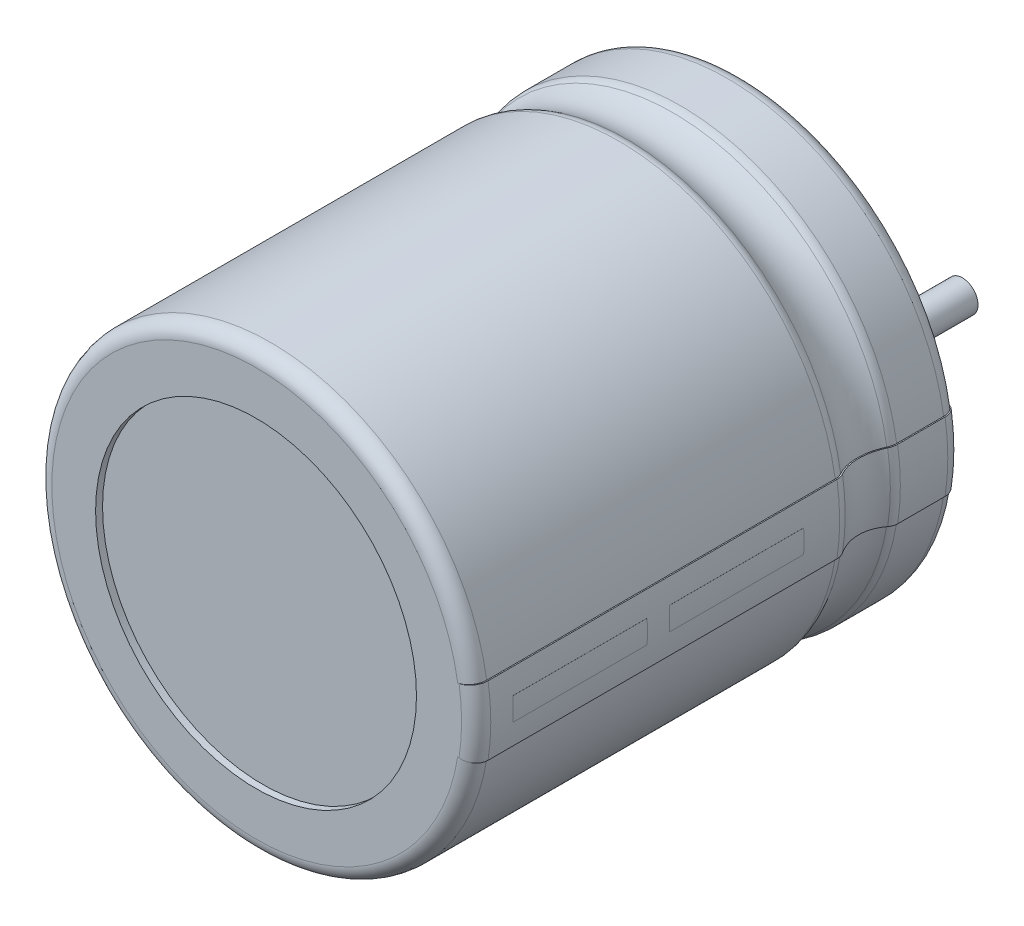
ISO-10303-21;
HEADER;
FILE_DESCRIPTION(('STEP AP214'),'2;1');
FILE_NAME('part.step','',(''),(''),'','','');
FILE_SCHEMA(('AUTOMOTIVE_DESIGN { 1 0 10303 214 1 1 1 1 }'));
ENDSEC;
DATA;
#1=APPLICATION_CONTEXT('core data for automotive mechanical design processes');
#2=APPLICATION_PROTOCOL_DEFINITION('international standard','automotive_design',2000,#1);
#3=PRODUCT_CONTEXT('',#1,'mechanical');
#4=PRODUCT('Part','Part','',(#3));
#5=PRODUCT_RELATED_PRODUCT_CATEGORY('part','',(#4));
#6=PRODUCT_DEFINITION_FORMATION('','',#4);
#7=PRODUCT_DEFINITION_CONTEXT('part definition',#1,'design');
#8=PRODUCT_DEFINITION('design','',#6,#7);
#9=PRODUCT_DEFINITION_SHAPE('','',#8);
#10=(LENGTH_UNIT() NAMED_UNIT(*) SI_UNIT(.MILLI.,.METRE.));
#11=(NAMED_UNIT(*) PLANE_ANGLE_UNIT() SI_UNIT($,.RADIAN.));
#12=(NAMED_UNIT(*) SI_UNIT($,.STERADIAN.) SOLID_ANGLE_UNIT());
#13=UNCERTAINTY_MEASURE_WITH_UNIT(LENGTH_MEASURE(1.E-05),#10,'distance_accuracy_value','');
#14=(GEOMETRIC_REPRESENTATION_CONTEXT(3) GLOBAL_UNCERTAINTY_ASSIGNED_CONTEXT((#13)) GLOBAL_UNIT_ASSIGNED_CONTEXT((#10,
#11,#12)) REPRESENTATION_CONTEXT('',''));
#15=CARTESIAN_POINT('',(0.,0.,0.));
#16=DIRECTION('',(0.,0.,1.));
#17=DIRECTION('',(1.,0.,0.));
#18=AXIS2_PLACEMENT_3D('',#15,#16,#17);
#19=CARTESIAN_POINT('',(0.000375956860391527,0.,1.33));
#20=DIRECTION('',(0.,0.,1.));
#21=DIRECTION('',(-1.,0.,0.));
#22=AXIS2_PLACEMENT_3D('',#19,#20,#21);
#23=TOROIDAL_SURFACE('',#22,3.654,0.63);
#24=CARTESIAN_POINT('',(3.60938915339502,-0.571611535257004,1.33));
#25=DIRECTION('',(0.156434465040231,0.987688340595138,0.));
#26=DIRECTION('',(0.987688340595138,-0.156434465040231,0.));
#27=AXIS2_PLACEMENT_3D('',#24,#25,#26);
#28=CIRCLE('',#27,0.63);
#29=CARTESIAN_POINT('',(3.08048204700633,-0.48784087922796,0.998126906785139));
#30=VERTEX_POINT('',#29);
#31=CARTESIAN_POINT('',(3.08048204700633,-0.48784087922796,1.66187309321486));
#32=VERTEX_POINT('',#31);
#33=EDGE_CURVE('E336',#30,#32,#28,.T.);
#34=ORIENTED_EDGE('',*,*,#33,.T.);
#35=CARTESIAN_POINT('',(0.000375956860391445,0.,1.66187309321486));
#36=DIRECTION('',(0.,0.,1.));
#37=DIRECTION('',(1.,0.,0.));
#38=AXIS2_PLACEMENT_3D('',#35,#36,#37);
#39=CIRCLE('',#38,3.1185);
#40=CARTESIAN_POINT('',(3.08048204700633,0.48784087922796,1.66187309321486));
#41=VERTEX_POINT('',#40);
#42=EDGE_CURVE('E345',#41,#32,#39,.T.);
#43=ORIENTED_EDGE('',*,*,#42,.F.);
#44=CARTESIAN_POINT('',(3.60938915339502,0.571611535257003,1.33));
#45=DIRECTION('',(0.156434465040231,-0.987688340595138,0.));
#46=DIRECTION('',(0.987688340595138,0.156434465040231,0.));
#47=AXIS2_PLACEMENT_3D('',#44,#45,#46);
#48=CIRCLE('',#47,0.63);
#49=CARTESIAN_POINT('',(3.08048204700633,0.48784087922796,0.998126906785139));
#50=VERTEX_POINT('',#49);
#51=EDGE_CURVE('E309',#41,#50,#48,.T.);
#52=ORIENTED_EDGE('',*,*,#51,.T.);
#53=CARTESIAN_POINT('',(0.000375956860391608,0.,0.998126906785138));
#54=DIRECTION('',(0.,0.,-1.));
#55=DIRECTION('',(1.,0.,0.));
#56=AXIS2_PLACEMENT_3D('',#53,#54,#55);
#57=CIRCLE('',#56,3.1185);
#58=EDGE_CURVE('E341',#30,#50,#57,.T.);
#59=ORIENTED_EDGE('',*,*,#58,.F.);
#60=EDGE_LOOP('',(#34,#43,#52,#59));
#61=FACE_BOUND('',#60,.T.);
#62=ADVANCED_FACE('F17',(#61),#23,.F.);
#63=CARTESIAN_POINT('',(0.000375956860391852,0.,0.));
#64=DIRECTION('',(0.,0.,-1.));
#65=DIRECTION('',(0.,-1.,0.));
#66=AXIS2_PLACEMENT_3D('',#63,#64,#65);
#67=PLANE('',#66);
#68=CARTESIAN_POINT('',(1.25037595686039,0.,0.));
#69=DIRECTION('',(0.,0.,1.));
#70=DIRECTION('',(1.,0.,0.));
#71=AXIS2_PLACEMENT_3D('',#68,#69,#70);
#72=CIRCLE('',#71,0.225);
#73=CARTESIAN_POINT('',(1.02537595686039,0.,0.));
#74=VERTEX_POINT('',#73);
#75=EDGE_CURVE('E286',#74,#74,#72,.T.);
#76=ORIENTED_EDGE('',*,*,#75,.T.);
#77=EDGE_LOOP('',(#76));
#78=FACE_BOUND('',#77,.T.);
#79=CARTESIAN_POINT('',(-1.24962404313961,0.,0.));
#80=DIRECTION('',(0.,0.,1.));
#81=DIRECTION('',(1.,0.,0.));
#82=AXIS2_PLACEMENT_3D('',#79,#80,#81);
#83=CIRCLE('',#82,0.225);
#84=CARTESIAN_POINT('',(-1.47462404313961,0.,0.));
#85=VERTEX_POINT('',#84);
#86=EDGE_CURVE('E329',#85,#85,#83,.T.);
#87=ORIENTED_EDGE('',*,*,#86,.T.);
#88=EDGE_LOOP('',(#87));
#89=FACE_BOUND('',#88,.T.);
#90=CARTESIAN_POINT('',(0.000375956860391852,0.,0.));
#91=DIRECTION('',(0.,0.,1.));
#92=DIRECTION('',(-1.,0.,0.));
#93=AXIS2_PLACEMENT_3D('',#90,#91,#92);
#94=CIRCLE('',#93,2.94);
#95=CARTESIAN_POINT('',(2.90417967821009,0.459917327218278,0.));
#96=VERTEX_POINT('',#95);
#97=CARTESIAN_POINT('',(2.90417967821009,-0.45991732721828,0.));
#98=VERTEX_POINT('',#97);
#99=EDGE_CURVE('E11',#96,#98,#94,.T.);
#100=ORIENTED_EDGE('',*,*,#99,.F.);
#101=DIRECTION('',(-0.987688340595138,-0.156434465040231,0.));
#102=VECTOR('',#101,1.);
#103=CARTESIAN_POINT('',(0.000375956860391616,0.,0.));
#104=LINE('',#103,#102);
#105=CARTESIAN_POINT('',(2.923933445022,0.463046016519083,0.));
#106=VERTEX_POINT('',#105);
#107=EDGE_CURVE('E452',#106,#96,#104,.T.);
#108=ORIENTED_EDGE('',*,*,#107,.F.);
#109=CARTESIAN_POINT('',(0.000375956860391852,0.,0.));
#110=DIRECTION('',(0.,0.,1.));
#111=DIRECTION('',(1.,0.,0.));
#112=AXIS2_PLACEMENT_3D('',#109,#110,#111);
#113=CIRCLE('',#112,2.96);
#114=CARTESIAN_POINT('',(2.923933445022,-0.463046016519085,0.));
#115=VERTEX_POINT('',#114);
#116=EDGE_CURVE('E368',#115,#106,#113,.T.);
#117=ORIENTED_EDGE('',*,*,#116,.F.);
#118=DIRECTION('',(0.987688340595138,-0.156434465040231,0.));
#119=VECTOR('',#118,1.);
#120=CARTESIAN_POINT('',(0.000375956860391852,0.,0.));
#121=LINE('',#120,#119);
#122=EDGE_CURVE('E410',#98,#115,#121,.T.);
#123=ORIENTED_EDGE('',*,*,#122,.F.);
#124=EDGE_LOOP('',(#100,#108,#117,#123));
#125=FACE_BOUND('',#124,.T.);
#126=ADVANCED_FACE('F552',(#78,#89,#125),#67,.T.);
#127=CARTESIAN_POINT('',(0.000375956860391801,0.,0.21));
#128=DIRECTION('',(0.,0.,-1.));
#129=DIRECTION('',(-1.,0.,0.));
#130=AXIS2_PLACEMENT_3D('',#127,#128,#129);
#131=TOROIDAL_SURFACE('',#130,2.94,0.21);
#132=CARTESIAN_POINT('',(2.9041796782101,-0.45991732721828,0.21));
#133=DIRECTION('',(-0.156434465040231,-0.987688340595138,0.));
#134=DIRECTION('',(0.987688340595138,-0.156434465040231,0.));
#135=AXIS2_PLACEMENT_3D('',#132,#133,#134);
#136=CIRCLE('',#135,0.21);
#137=CARTESIAN_POINT('',(3.11159422973507,-0.492768564876728,0.21));
#138=VERTEX_POINT('',#137);
#139=EDGE_CURVE('E357',#98,#138,#136,.T.);
#140=ORIENTED_EDGE('',*,*,#139,.T.);
#141=CARTESIAN_POINT('',(0.000375956860391801,0.,0.21));
#142=DIRECTION('',(0.,0.,-1.));
#143=DIRECTION('',(-1.,0.,0.));
#144=AXIS2_PLACEMENT_3D('',#141,#142,#143);
#145=CIRCLE('',#144,3.15);
#146=CARTESIAN_POINT('',(3.11159422973507,0.492768564876726,0.21));
#147=VERTEX_POINT('',#146);
#148=EDGE_CURVE('E28',#138,#147,#145,.T.);
#149=ORIENTED_EDGE('',*,*,#148,.T.);
#150=CARTESIAN_POINT('',(2.9041796782101,0.459917327218278,0.21));
#151=DIRECTION('',(-0.156434465040231,0.987688340595138,0.));
#152=DIRECTION('',(0.987688340595138,0.156434465040231,0.));
#153=AXIS2_PLACEMENT_3D('',#150,#151,#152);
#154=CIRCLE('',#153,0.21);
#155=EDGE_CURVE('E456',#147,#96,#154,.T.);
#156=ORIENTED_EDGE('',*,*,#155,.T.);
#157=ORIENTED_EDGE('',*,*,#99,.T.);
#158=EDGE_LOOP('',(#140,#149,#156,#157));
#159=FACE_BOUND('',#158,.T.);
#160=ADVANCED_FACE('F555',(#159),#131,.T.);
#161=CARTESIAN_POINT('',(0.000375956860390995,0.,3.5));
#162=DIRECTION('',(0.,0.,1.));
#163=DIRECTION('',(-1.,0.,0.));
#164=AXIS2_PLACEMENT_3D('',#161,#162,#163);
#165=CYLINDRICAL_SURFACE('',#164,3.15);
#166=DIRECTION('',(0.,0.,1.));
#167=VECTOR('',#166,1.);
#168=CARTESIAN_POINT('',(3.11159422973507,-0.492768564876727,3.5));
#169=LINE('',#168,#167);
#170=CARTESIAN_POINT('',(3.11159422973507,-0.492768564876728,0.887502542380186));
#171=VERTEX_POINT('',#170);
#172=EDGE_CURVE('E335',#138,#171,#169,.T.);
#173=ORIENTED_EDGE('',*,*,#172,.T.);
#174=CARTESIAN_POINT('',(0.000375956860391635,0.,0.887502542380185));
#175=DIRECTION('',(0.,0.,1.));
#176=DIRECTION('',(1.,0.,0.));
#177=AXIS2_PLACEMENT_3D('',#174,#175,#176);
#178=CIRCLE('',#177,3.15);
#179=CARTESIAN_POINT('',(3.11159422973507,0.492768564876726,0.887502542380186));
#180=VERTEX_POINT('',#179);
#181=EDGE_CURVE('E344',#180,#171,#178,.T.);
#182=ORIENTED_EDGE('',*,*,#181,.F.);
#183=DIRECTION('',(0.,0.,-1.));
#184=VECTOR('',#183,1.);
#185=CARTESIAN_POINT('',(3.11159422973507,0.492768564876727,3.5));
#186=LINE('',#185,#184);
#187=EDGE_CURVE('E397',#180,#147,#186,.T.);
#188=ORIENTED_EDGE('',*,*,#187,.T.);
#189=ORIENTED_EDGE('',*,*,#148,.F.);
#190=EDGE_LOOP('',(#173,#182,#188,#189));
#191=FACE_BOUND('',#190,.T.);
#192=ADVANCED_FACE('F579',(#191),#165,.T.);
#193=CARTESIAN_POINT('',(0.000375956860391635,0.,0.887502542380185));
#194=DIRECTION('',(0.,0.,-1.));
#195=DIRECTION('',(-1.,0.,0.));
#196=AXIS2_PLACEMENT_3D('',#193,#194,#195);
#197=TOROIDAL_SURFACE('',#196,2.94,0.21);
#198=CARTESIAN_POINT('',(2.9041796782101,-0.459917327218279,0.887502542380186));
#199=DIRECTION('',(-0.156434465040231,-0.987688340595138,0.));
#200=DIRECTION('',(0.987688340595138,-0.156434465040231,0.));
#201=AXIS2_PLACEMENT_3D('',#198,#199,#200);
#202=CIRCLE('',#201,0.21);
#203=EDGE_CURVE('E331',#171,#30,#202,.T.);
#204=ORIENTED_EDGE('',*,*,#203,.T.);
#205=ORIENTED_EDGE('',*,*,#58,.T.);
#206=CARTESIAN_POINT('',(2.9041796782101,0.459917327218279,0.887502542380186));
#207=DIRECTION('',(-0.156434465040231,0.987688340595138,0.));
#208=DIRECTION('',(0.987688340595138,0.156434465040231,0.));
#209=AXIS2_PLACEMENT_3D('',#206,#207,#208);
#210=CIRCLE('',#209,0.21);
#211=EDGE_CURVE('E313',#50,#180,#210,.T.);
#212=ORIENTED_EDGE('',*,*,#211,.T.);
#213=ORIENTED_EDGE('',*,*,#181,.T.);
#214=EDGE_LOOP('',(#204,#205,#212,#213));
#215=FACE_BOUND('',#214,.T.);
#216=ADVANCED_FACE('F609',(#215),#197,.T.);
#217=CARTESIAN_POINT('',(0.000375956860391418,0.,1.77249745761982));
#218=DIRECTION('',(0.,0.,1.));
#219=DIRECTION('',(-1.,0.,0.));
#220=AXIS2_PLACEMENT_3D('',#217,#218,#219);
#221=TOROIDAL_SURFACE('',#220,2.94,0.21);
#222=CARTESIAN_POINT('',(2.9041796782101,-0.459917327218279,1.77249745761982));
#223=DIRECTION('',(-0.156434465040231,-0.987688340595138,0.));
#224=DIRECTION('',(0.987688340595138,-0.156434465040231,0.));
#225=AXIS2_PLACEMENT_3D('',#222,#223,#224);
#226=CIRCLE('',#225,0.21);
#227=CARTESIAN_POINT('',(3.11159422973507,-0.492768564876727,1.77249745761982));
#228=VERTEX_POINT('',#227);
#229=EDGE_CURVE('E349',#32,#228,#226,.T.);
#230=ORIENTED_EDGE('',*,*,#229,.T.);
#231=CARTESIAN_POINT('',(0.000375956860391418,0.,1.77249745761982));
#232=DIRECTION('',(0.,0.,-1.));
#233=DIRECTION('',(1.,0.,0.));
#234=AXIS2_PLACEMENT_3D('',#231,#232,#233);
#235=CIRCLE('',#234,3.15);
#236=CARTESIAN_POINT('',(3.11159422973507,0.492768564876727,1.77249745761982));
#237=VERTEX_POINT('',#236);
#238=EDGE_CURVE('E42',#228,#237,#235,.T.);
#239=ORIENTED_EDGE('',*,*,#238,.T.);
#240=CARTESIAN_POINT('',(2.9041796782101,0.459917327218279,1.77249745761982));
#241=DIRECTION('',(-0.156434465040231,0.987688340595138,0.));
#242=DIRECTION('',(0.987688340595138,0.156434465040231,0.));
#243=AXIS2_PLACEMENT_3D('',#240,#241,#242);
#244=CIRCLE('',#243,0.21);
#245=EDGE_CURVE('E295',#237,#41,#244,.T.);
#246=ORIENTED_EDGE('',*,*,#245,.T.);
#247=ORIENTED_EDGE('',*,*,#42,.T.);
#248=EDGE_LOOP('',(#230,#239,#246,#247));
#249=FACE_BOUND('',#248,.T.);
#250=ADVANCED_FACE('F605',(#249),#221,.T.);
#251=CARTESIAN_POINT('',(0.000375956860390995,0.,3.5));
#252=DIRECTION('',(0.,0.,1.));
#253=DIRECTION('',(-1.,0.,0.));
#254=AXIS2_PLACEMENT_3D('',#251,#252,#253);
#255=CYLINDRICAL_SURFACE('',#254,3.15);
#256=DIRECTION('',(0.,0.,1.));
#257=VECTOR('',#256,1.);
#258=CARTESIAN_POINT('',(3.11159422973507,-0.492768564876727,3.5));
#259=LINE('',#258,#257);
#260=CARTESIAN_POINT('',(3.11159422973507,-0.492768564876726,6.79));
#261=VERTEX_POINT('',#260);
#262=EDGE_CURVE('E323',#228,#261,#259,.T.);
#263=ORIENTED_EDGE('',*,*,#262,.T.);
#264=CARTESIAN_POINT('',(0.000375956860390189,0.,6.79));
#265=DIRECTION('',(0.,0.,1.));
#266=DIRECTION('',(-1.,0.,0.));
#267=AXIS2_PLACEMENT_3D('',#264,#265,#266);
#268=CIRCLE('',#267,3.15);
#269=CARTESIAN_POINT('',(3.11159422973507,0.492768564876729,6.79));
#270=VERTEX_POINT('',#269);
#271=EDGE_CURVE('E337',#270,#261,#268,.T.);
#272=ORIENTED_EDGE('',*,*,#271,.F.);
#273=DIRECTION('',(0.,0.,-1.));
#274=VECTOR('',#273,1.);
#275=CARTESIAN_POINT('',(3.11159422973507,0.492768564876727,3.5));
#276=LINE('',#275,#274);
#277=EDGE_CURVE('E291',#270,#237,#276,.T.);
#278=ORIENTED_EDGE('',*,*,#277,.T.);
#279=ORIENTED_EDGE('',*,*,#238,.F.);
#280=EDGE_LOOP('',(#263,#272,#278,#279));
#281=FACE_BOUND('',#280,.T.);
#282=ADVANCED_FACE('F603',(#281),#255,.T.);
#283=CARTESIAN_POINT('',(0.000375956860390189,0.,6.79));
#284=DIRECTION('',(0.,0.,1.));
#285=DIRECTION('',(-1.,0.,0.));
#286=AXIS2_PLACEMENT_3D('',#283,#284,#285);
#287=TOROIDAL_SURFACE('',#286,2.94,0.21);
#288=CARTESIAN_POINT('',(2.9041796782101,-0.459917327218278,6.79));
#289=DIRECTION('',(-0.156434465040231,-0.987688340595138,0.));
#290=DIRECTION('',(0.987688340595138,-0.156434465040231,0.));
#291=AXIS2_PLACEMENT_3D('',#288,#289,#290);
#292=CIRCLE('',#291,0.21);
#293=CARTESIAN_POINT('',(2.9041796782101,-0.459917327218277,7.));
#294=VERTEX_POINT('',#293);
#295=EDGE_CURVE('E319',#261,#294,#292,.T.);
#296=ORIENTED_EDGE('',*,*,#295,.T.);
#297=CARTESIAN_POINT('',(0.000375956860390138,0.,7.));
#298=DIRECTION('',(0.,0.,-1.));
#299=DIRECTION('',(-1.,0.,0.));
#300=AXIS2_PLACEMENT_3D('',#297,#298,#299);
#301=CIRCLE('',#300,2.94);
#302=CARTESIAN_POINT('',(2.9041796782101,0.45991732721828,7.));
#303=VERTEX_POINT('',#302);
#304=EDGE_CURVE('E340',#294,#303,#301,.T.);
#305=ORIENTED_EDGE('',*,*,#304,.T.);
#306=CARTESIAN_POINT('',(2.9041796782101,0.45991732721828,6.79));
#307=DIRECTION('',(-0.156434465040231,0.987688340595138,0.));
#308=DIRECTION('',(0.987688340595138,0.156434465040231,0.));
#309=AXIS2_PLACEMENT_3D('',#306,#307,#308);
#310=CIRCLE('',#309,0.21);
#311=EDGE_CURVE('E308',#303,#270,#310,.T.);
#312=ORIENTED_EDGE('',*,*,#311,.T.);
#313=ORIENTED_EDGE('',*,*,#271,.T.);
#314=EDGE_LOOP('',(#296,#305,#312,#313));
#315=FACE_BOUND('',#314,.T.);
#316=ADVANCED_FACE('F19',(#315),#287,.T.);
#317=CARTESIAN_POINT('',(0.000375956860390138,0.,7.));
#318=DIRECTION('',(0.,0.,1.));
#319=DIRECTION('',(1.,0.,0.));
#320=AXIS2_PLACEMENT_3D('',#317,#318,#319);
#321=PLANE('',#320);
#322=CARTESIAN_POINT('',(0.000375956860390138,0.,7.));
#323=DIRECTION('',(0.,0.,-1.));
#324=DIRECTION('',(1.,0.,0.));
#325=AXIS2_PLACEMENT_3D('',#322,#323,#324);
#326=CIRCLE('',#325,2.31);
#327=CARTESIAN_POINT('',(-2.30962404313961,0.,7.));
#328=VERTEX_POINT('',#327);
#329=EDGE_CURVE('E373',#328,#328,#326,.T.);
#330=ORIENTED_EDGE('',*,*,#329,.T.);
#331=EDGE_LOOP('',(#330));
#332=FACE_BOUND('',#331,.T.);
#333=DIRECTION('',(-0.987688340595138,0.156434465040231,0.));
#334=VECTOR('',#333,1.);
#335=CARTESIAN_POINT('',(3.13134799654698,-0.49589725417753,7.));
#336=LINE('',#335,#334);
#337=CARTESIAN_POINT('',(2.923933445022,-0.463046016519082,7.));
#338=VERTEX_POINT('',#337);
#339=EDGE_CURVE('E287',#338,#294,#336,.T.);
#340=ORIENTED_EDGE('',*,*,#339,.F.);
#341=CARTESIAN_POINT('',(0.000375956860390205,0.,7.));
#342=DIRECTION('',(0.,0.,-1.));
#343=DIRECTION('',(1.,0.,0.));
#344=AXIS2_PLACEMENT_3D('',#341,#342,#343);
#345=CIRCLE('',#344,2.96);
#346=CARTESIAN_POINT('',(2.923933445022,0.463046016519085,7.));
#347=VERTEX_POINT('',#346);
#348=EDGE_CURVE('E303',#347,#338,#345,.T.);
#349=ORIENTED_EDGE('',*,*,#348,.F.);
#350=DIRECTION('',(0.987688340595138,0.156434465040231,0.));
#351=VECTOR('',#350,1.);
#352=CARTESIAN_POINT('',(3.13134799654698,0.495897254177533,7.));
#353=LINE('',#352,#351);
#354=EDGE_CURVE('E305',#303,#347,#353,.T.);
#355=ORIENTED_EDGE('',*,*,#354,.F.);
#356=ORIENTED_EDGE('',*,*,#304,.F.);
#357=EDGE_LOOP('',(#340,#349,#355,#356));
#358=FACE_BOUND('',#357,.T.);
#359=ADVANCED_FACE('F597',(#332,#358),#321,.T.);
#360=CARTESIAN_POINT('',(0.000375956860391629,0.,0.893234616756315));
#361=DIRECTION('',(0.,0.,-1.));
#362=DIRECTION('',(1.,0.,0.));
#363=AXIS2_PLACEMENT_3D('',#360,#361,#362);
#364=TOROIDAL_SURFACE('',#363,2.96,0.21);
#365=CARTESIAN_POINT('',(2.923933445022,-0.463046016519085,0.893234616756316));
#366=DIRECTION('',(0.156434465040231,0.987688340595138,0.));
#367=DIRECTION('',(0.987688340595138,-0.156434465040231,0.));
#368=AXIS2_PLACEMENT_3D('',#365,#366,#367);
#369=CIRCLE('',#368,0.21);
#370=CARTESIAN_POINT('',(3.09947698009314,-0.490849381073918,1.0050891661236));
#371=VERTEX_POINT('',#370);
#372=CARTESIAN_POINT('',(3.13134799654698,-0.495897254177533,0.893234616756316));
#373=VERTEX_POINT('',#372);
#374=EDGE_CURVE('E282',#371,#373,#369,.T.);
#375=ORIENTED_EDGE('',*,*,#374,.T.);
#376=CARTESIAN_POINT('',(0.000375956860391629,0.,0.893234616756315));
#377=DIRECTION('',(0.,0.,1.));
#378=DIRECTION('',(1.,0.,0.));
#379=AXIS2_PLACEMENT_3D('',#376,#377,#378);
#380=CIRCLE('',#379,3.17);
#381=CARTESIAN_POINT('',(3.13134799654698,0.495897254177531,0.893234616756316));
#382=VERTEX_POINT('',#381);
#383=EDGE_CURVE('E448',#373,#382,#380,.T.);
#384=ORIENTED_EDGE('',*,*,#383,.T.);
#385=CARTESIAN_POINT('',(2.923933445022,0.463046016519084,0.893234616756316));
#386=DIRECTION('',(0.156434465040231,-0.987688340595138,0.));
#387=DIRECTION('',(0.987688340595138,0.156434465040231,0.));
#388=AXIS2_PLACEMENT_3D('',#385,#386,#387);
#389=CIRCLE('',#388,0.21);
#390=CARTESIAN_POINT('',(3.09947698009314,0.490849381073917,1.0050891661236));
#391=VERTEX_POINT('',#390);
#392=EDGE_CURVE('E457',#382,#391,#389,.T.);
#393=ORIENTED_EDGE('',*,*,#392,.T.);
#394=CARTESIAN_POINT('',(0.000375956860391606,0.,1.0050891661236));
#395=DIRECTION('',(0.,0.,-1.));
#396=DIRECTION('',(1.,0.,0.));
#397=AXIS2_PLACEMENT_3D('',#394,#395,#396);
#398=CIRCLE('',#397,3.13773170731707);
#399=EDGE_CURVE('E400',#391,#371,#398,.T.);
#400=ORIENTED_EDGE('',*,*,#399,.T.);
#401=EDGE_LOOP('',(#375,#384,#393,#400));
#402=FACE_BOUND('',#401,.T.);
#403=ADVANCED_FACE('F692',(#402),#364,.T.);
#404=CARTESIAN_POINT('',(0.000375956860391527,0.,1.33));
#405=DIRECTION('',(0.,0.,1.));
#406=DIRECTION('',(1.,0.,0.));
#407=AXIS2_PLACEMENT_3D('',#404,#405,#406);
#408=TOROIDAL_SURFACE('',#407,3.654,0.61);
#409=CARTESIAN_POINT('',(0.000375956860391447,0.,1.6549108338764));
#410=DIRECTION('',(0.,0.,1.));
#411=DIRECTION('',(1.,0.,0.));
#412=AXIS2_PLACEMENT_3D('',#409,#410,#411);
#413=CIRCLE('',#412,3.13773170731707);
#414=CARTESIAN_POINT('',(3.09947698009314,-0.490849381073917,1.6549108338764));
#415=VERTEX_POINT('',#414);
#416=CARTESIAN_POINT('',(3.09947698009314,0.490849381073917,1.6549108338764));
#417=VERTEX_POINT('',#416);
#418=EDGE_CURVE('E294',#415,#417,#413,.T.);
#419=ORIENTED_EDGE('',*,*,#418,.F.);
#420=CARTESIAN_POINT('',(3.60938915339502,-0.571611535257004,1.33));
#421=DIRECTION('',(0.156434465040231,0.987688340595138,0.));
#422=DIRECTION('',(0.987688340595138,-0.156434465040231,0.));
#423=AXIS2_PLACEMENT_3D('',#420,#421,#422);
#424=CIRCLE('',#423,0.61);
#425=EDGE_CURVE('E275',#371,#415,#424,.T.);
#426=ORIENTED_EDGE('',*,*,#425,.F.);
#427=ORIENTED_EDGE('',*,*,#399,.F.);
#428=CARTESIAN_POINT('',(3.60938915339502,0.571611535257003,1.33));
#429=DIRECTION('',(0.156434465040231,-0.987688340595138,0.));
#430=DIRECTION('',(0.987688340595138,0.156434465040231,0.));
#431=AXIS2_PLACEMENT_3D('',#428,#429,#430);
#432=CIRCLE('',#431,0.61);
#433=EDGE_CURVE('E494',#417,#391,#432,.T.);
#434=ORIENTED_EDGE('',*,*,#433,.F.);
#435=EDGE_LOOP('',(#419,#426,#427,#434));
#436=FACE_BOUND('',#435,.T.);
#437=ADVANCED_FACE('F698',(#436),#408,.F.);
#438=CARTESIAN_POINT('',(0.000375956860391424,0.,1.76676538324369));
#439=DIRECTION('',(0.,0.,1.));
#440=DIRECTION('',(1.,0.,0.));
#441=AXIS2_PLACEMENT_3D('',#438,#439,#440);
#442=TOROIDAL_SURFACE('',#441,2.96,0.21);
#443=CARTESIAN_POINT('',(2.923933445022,0.463046016519084,1.76676538324369));
#444=DIRECTION('',(0.156434465040231,-0.987688340595138,0.));
#445=DIRECTION('',(0.987688340595138,0.156434465040231,0.));
#446=AXIS2_PLACEMENT_3D('',#443,#444,#445);
#447=CIRCLE('',#446,0.21);
#448=CARTESIAN_POINT('',(3.13134799654698,0.495897254177532,1.76676538324369));
#449=VERTEX_POINT('',#448);
#450=EDGE_CURVE('E253',#417,#449,#447,.T.);
#451=ORIENTED_EDGE('',*,*,#450,.T.);
#452=CARTESIAN_POINT('',(0.000375956860391424,0.,1.76676538324369));
#453=DIRECTION('',(0.,0.,-1.));
#454=DIRECTION('',(1.,0.,0.));
#455=AXIS2_PLACEMENT_3D('',#452,#453,#454);
#456=CIRCLE('',#455,3.17);
#457=CARTESIAN_POINT('',(3.13134799654698,-0.495897254177532,1.76676538324369));
#458=VERTEX_POINT('',#457);
#459=EDGE_CURVE('E246',#449,#458,#456,.T.);
#460=ORIENTED_EDGE('',*,*,#459,.T.);
#461=CARTESIAN_POINT('',(2.923933445022,-0.463046016519084,1.76676538324369));
#462=DIRECTION('',(0.156434465040231,0.987688340595138,0.));
#463=DIRECTION('',(0.987688340595138,-0.156434465040231,0.));
#464=AXIS2_PLACEMENT_3D('',#461,#462,#463);
#465=CIRCLE('',#464,0.21);
#466=EDGE_CURVE('E250',#458,#415,#465,.T.);
#467=ORIENTED_EDGE('',*,*,#466,.T.);
#468=ORIENTED_EDGE('',*,*,#418,.T.);
#469=EDGE_LOOP('',(#451,#460,#467,#468));
#470=FACE_BOUND('',#469,.T.);
#471=ADVANCED_FACE('F248',(#470),#442,.T.);
#472=CARTESIAN_POINT('',(0.000375956860391616,0.,0.));
#473=DIRECTION('',(-0.156434465040231,0.987688340595138,0.));
#474=DIRECTION('',(0.,0.,1.));
#475=AXIS2_PLACEMENT_3D('',#472,#473,#474);
#476=PLANE('',#475);
#477=ORIENTED_EDGE('',*,*,#311,.F.);
#478=ORIENTED_EDGE('',*,*,#354,.T.);
#479=CARTESIAN_POINT('',(2.923933445022,0.463046016519085,6.79));
#480=DIRECTION('',(0.156434465040231,-0.987688340595138,0.));
#481=DIRECTION('',(0.987688340595138,0.156434465040231,0.));
#482=AXIS2_PLACEMENT_3D('',#479,#480,#481);
#483=CIRCLE('',#482,0.21);
#484=CARTESIAN_POINT('',(3.13134799654698,0.495897254177534,6.79));
#485=VERTEX_POINT('',#484);
#486=EDGE_CURVE('E290',#485,#347,#483,.T.);
#487=ORIENTED_EDGE('',*,*,#486,.F.);
#488=DIRECTION('',(0.,0.,-1.));
#489=VECTOR('',#488,1.);
#490=CARTESIAN_POINT('',(3.13134799654698,0.495897254177531,0.));
#491=LINE('',#490,#489);
#492=EDGE_CURVE('E258',#485,#449,#491,.T.);
#493=ORIENTED_EDGE('',*,*,#492,.T.);
#494=ORIENTED_EDGE('',*,*,#450,.F.);
#495=ORIENTED_EDGE('',*,*,#433,.T.);
#496=ORIENTED_EDGE('',*,*,#392,.F.);
#497=DIRECTION('',(0.,0.,-1.));
#498=VECTOR('',#497,1.);
#499=CARTESIAN_POINT('',(3.13134799654698,0.495897254177531,0.));
#500=LINE('',#499,#498);
#501=CARTESIAN_POINT('',(3.13134799654698,0.495897254177531,0.21));
#502=VERTEX_POINT('',#501);
#503=EDGE_CURVE('E442',#382,#502,#500,.T.);
#504=ORIENTED_EDGE('',*,*,#503,.T.);
#505=CARTESIAN_POINT('',(2.923933445022,0.463046016519083,0.21));
#506=DIRECTION('',(0.156434465040231,-0.987688340595138,0.));
#507=DIRECTION('',(0.987688340595138,0.156434465040231,0.));
#508=AXIS2_PLACEMENT_3D('',#505,#506,#507);
#509=CIRCLE('',#508,0.21);
#510=EDGE_CURVE('E369',#106,#502,#509,.T.);
#511=ORIENTED_EDGE('',*,*,#510,.F.);
#512=ORIENTED_EDGE('',*,*,#107,.T.);
#513=ORIENTED_EDGE('',*,*,#155,.F.);
#514=ORIENTED_EDGE('',*,*,#187,.F.);
#515=ORIENTED_EDGE('',*,*,#211,.F.);
#516=ORIENTED_EDGE('',*,*,#51,.F.);
#517=ORIENTED_EDGE('',*,*,#245,.F.);
#518=ORIENTED_EDGE('',*,*,#277,.F.);
#519=EDGE_LOOP('',(#477,#478,#487,#493,#494,#495,#496,#504,#511,#512,#513,#514,#515,#516,#517,#518));
#520=FACE_BOUND('',#519,.T.);
#521=ADVANCED_FACE('F567',(#520),#476,.T.);
#522=CARTESIAN_POINT('',(0.000375956860391029,0.,3.5));
#523=DIRECTION('',(0.,0.,1.));
#524=DIRECTION('',(0.987688340595138,-0.156434465040231,0.));
#525=AXIS2_PLACEMENT_3D('',#522,#523,#524);
#526=CYLINDRICAL_SURFACE('',#525,3.17);
#527=CARTESIAN_POINT('',(0.000375956860391803,0.,0.21));
#528=DIRECTION('',(0.,0.,-1.));
#529=DIRECTION('',(1.,0.,0.));
#530=AXIS2_PLACEMENT_3D('',#527,#528,#529);
#531=CIRCLE('',#530,3.17);
#532=CARTESIAN_POINT('',(3.13134799654698,-0.495897254177533,0.21));
#533=VERTEX_POINT('',#532);
#534=EDGE_CURVE('E365',#502,#533,#531,.T.);
#535=ORIENTED_EDGE('',*,*,#534,.F.);
#536=ORIENTED_EDGE('',*,*,#503,.F.);
#537=ORIENTED_EDGE('',*,*,#383,.F.);
#538=DIRECTION('',(0.,0.,1.));
#539=VECTOR('',#538,1.);
#540=CARTESIAN_POINT('',(3.13134799654698,-0.495897254177533,0.));
#541=LINE('',#540,#539);
#542=EDGE_CURVE('E409',#533,#373,#541,.T.);
#543=ORIENTED_EDGE('',*,*,#542,.F.);
#544=EDGE_LOOP('',(#535,#536,#537,#543));
#545=FACE_BOUND('',#544,.T.);
#546=ADVANCED_FACE('F676',(#545),#526,.T.);
#547=CARTESIAN_POINT('',(0.000375956860391803,0.,0.21));
#548=DIRECTION('',(0.,0.,1.));
#549=DIRECTION('',(1.,0.,0.));
#550=AXIS2_PLACEMENT_3D('',#547,#548,#549);
#551=TOROIDAL_SURFACE('',#550,2.96,0.21);
#552=ORIENTED_EDGE('',*,*,#510,.T.);
#553=ORIENTED_EDGE('',*,*,#534,.T.);
#554=CARTESIAN_POINT('',(2.923933445022,-0.463046016519085,0.21));
#555=DIRECTION('',(0.156434465040231,0.987688340595138,0.));
#556=DIRECTION('',(0.987688340595138,-0.156434465040231,0.));
#557=AXIS2_PLACEMENT_3D('',#554,#555,#556);
#558=CIRCLE('',#557,0.21);
#559=EDGE_CURVE('E405',#533,#115,#558,.T.);
#560=ORIENTED_EDGE('',*,*,#559,.T.);
#561=ORIENTED_EDGE('',*,*,#116,.T.);
#562=EDGE_LOOP('',(#552,#553,#560,#561));
#563=FACE_BOUND('',#562,.T.);
#564=ADVANCED_FACE('F571',(#563),#551,.T.);
#565=CARTESIAN_POINT('',(0.000375956860391029,0.,3.5));
#566=DIRECTION('',(0.,0.,1.));
#567=DIRECTION('',(0.987688340595138,-0.156434465040231,0.));
#568=AXIS2_PLACEMENT_3D('',#565,#566,#567);
#569=CYLINDRICAL_SURFACE('',#568,3.17);
#570=CARTESIAN_POINT('',(0.00037595686039033,0.,6.468));
#571=DIRECTION('',(0.,0.,1.));
#572=DIRECTION('',(0.987688340595138,-0.156434465040231,0.));
#573=AXIS2_PLACEMENT_3D('',#570,#571,#572);
#574=CIRCLE('',#573,3.17);
#575=CARTESIAN_POINT('',(3.16603158203239,-0.165904981290131,6.468));
#576=VERTEX_POINT('',#575);
#577=CARTESIAN_POINT('',(3.16603158203239,0.165904981290133,6.468));
#578=VERTEX_POINT('',#577);
#579=EDGE_CURVE('E389',#576,#578,#574,.T.);
#580=ORIENTED_EDGE('',*,*,#579,.T.);
#581=DIRECTION('',(0.,0.,-1.));
#582=VECTOR('',#581,1.);
#583=CARTESIAN_POINT('',(3.16603158203239,0.165904981290132,3.5));
#584=LINE('',#583,#582);
#585=CARTESIAN_POINT('',(3.16603158203239,0.165904981290132,4.536));
#586=VERTEX_POINT('',#585);
#587=EDGE_CURVE('E382',#578,#586,#584,.T.);
#588=ORIENTED_EDGE('',*,*,#587,.T.);
#589=CARTESIAN_POINT('',(0.000375956860390785,0.,4.536));
#590=DIRECTION('',(0.,0.,-1.));
#591=DIRECTION('',(0.987688340595138,-0.156434465040231,0.));
#592=AXIS2_PLACEMENT_3D('',#589,#590,#591);
#593=CIRCLE('',#592,3.17);
#594=CARTESIAN_POINT('',(3.16603158203239,-0.165904981290132,4.536));
#595=VERTEX_POINT('',#594);
#596=EDGE_CURVE('E431',#586,#595,#593,.T.);
#597=ORIENTED_EDGE('',*,*,#596,.T.);
#598=DIRECTION('',(0.,0.,1.));
#599=VECTOR('',#598,1.);
#600=CARTESIAN_POINT('',(3.16603158203239,-0.165904981290132,3.5));
#601=LINE('',#600,#599);
#602=EDGE_CURVE('E324',#595,#576,#601,.T.);
#603=ORIENTED_EDGE('',*,*,#602,.T.);
#604=EDGE_LOOP('',(#580,#588,#597,#603));
#605=FACE_BOUND('',#604,.T.);
#606=CARTESIAN_POINT('',(0.000375956860390861,0.,4.214));
#607=DIRECTION('',(0.,0.,1.));
#608=DIRECTION('',(0.987688340595138,-0.156434465040231,0.));
#609=AXIS2_PLACEMENT_3D('',#606,#607,#608);
#610=CIRCLE('',#609,3.17);
#611=CARTESIAN_POINT('',(3.16603158203239,-0.165904981290132,4.214));
#612=VERTEX_POINT('',#611);
#613=CARTESIAN_POINT('',(3.16603158203239,0.165904981290132,4.214));
#614=VERTEX_POINT('',#613);
#615=EDGE_CURVE('E479',#612,#614,#610,.T.);
#616=ORIENTED_EDGE('',*,*,#615,.T.);
#617=DIRECTION('',(0.,0.,-1.));
#618=VECTOR('',#617,1.);
#619=CARTESIAN_POINT('',(3.16603158203239,0.165904981290132,3.5));
#620=LINE('',#619,#618);
#621=CARTESIAN_POINT('',(3.16603158203239,0.165904981290132,2.282));
#622=VERTEX_POINT('',#621);
#623=EDGE_CURVE('E379',#614,#622,#620,.T.);
#624=ORIENTED_EDGE('',*,*,#623,.T.);
#625=CARTESIAN_POINT('',(0.000375956860391315,0.,2.282));
#626=DIRECTION('',(0.,0.,-1.));
#627=DIRECTION('',(0.987688340595138,-0.156434465040231,0.));
#628=AXIS2_PLACEMENT_3D('',#625,#626,#627);
#629=CIRCLE('',#628,3.17);
#630=CARTESIAN_POINT('',(3.16603158203239,-0.165904981290132,2.282));
#631=VERTEX_POINT('',#630);
#632=EDGE_CURVE('E404',#622,#631,#629,.T.);
#633=ORIENTED_EDGE('',*,*,#632,.T.);
#634=DIRECTION('',(0.,0.,1.));
#635=VECTOR('',#634,1.);
#636=CARTESIAN_POINT('',(3.16603158203239,-0.165904981290132,3.5));
#637=LINE('',#636,#635);
#638=EDGE_CURVE('E167',#631,#612,#637,.T.);
#639=ORIENTED_EDGE('',*,*,#638,.T.);
#640=EDGE_LOOP('',(#616,#624,#633,#639));
#641=FACE_BOUND('',#640,.T.);
#642=CARTESIAN_POINT('',(0.000375956860390254,0.,6.79));
#643=DIRECTION('',(0.,0.,1.));
#644=DIRECTION('',(1.,0.,0.));
#645=AXIS2_PLACEMENT_3D('',#642,#643,#644);
#646=CIRCLE('',#645,3.17);
#647=CARTESIAN_POINT('',(3.13134799654698,-0.495897254177531,6.79));
#648=VERTEX_POINT('',#647);
#649=EDGE_CURVE('E259',#648,#485,#646,.T.);
#650=ORIENTED_EDGE('',*,*,#649,.F.);
#651=DIRECTION('',(0.,0.,1.));
#652=VECTOR('',#651,1.);
#653=CARTESIAN_POINT('',(3.13134799654698,-0.495897254177533,0.));
#654=LINE('',#653,#652);
#655=EDGE_CURVE('E262',#458,#648,#654,.T.);
#656=ORIENTED_EDGE('',*,*,#655,.F.);
#657=ORIENTED_EDGE('',*,*,#459,.F.);
#658=ORIENTED_EDGE('',*,*,#492,.F.);
#659=EDGE_LOOP('',(#650,#656,#657,#658));
#660=FACE_BOUND('',#659,.T.);
#661=ADVANCED_FACE('F263',(#605,#641,#660),#569,.T.);
#662=CARTESIAN_POINT('',(0.000375956860390254,0.,6.79));
#663=DIRECTION('',(0.,0.,1.));
#664=DIRECTION('',(1.,0.,0.));
#665=AXIS2_PLACEMENT_3D('',#662,#663,#664);
#666=TOROIDAL_SURFACE('',#665,2.96,0.21);
#667=ORIENTED_EDGE('',*,*,#486,.T.);
#668=ORIENTED_EDGE('',*,*,#348,.T.);
#669=CARTESIAN_POINT('',(2.923933445022,-0.463046016519082,6.79));
#670=DIRECTION('',(0.156434465040231,0.987688340595138,0.));
#671=DIRECTION('',(0.987688340595138,-0.156434465040231,0.));
#672=AXIS2_PLACEMENT_3D('',#669,#670,#671);
#673=CIRCLE('',#672,0.21);
#674=EDGE_CURVE('E269',#338,#648,#673,.T.);
#675=ORIENTED_EDGE('',*,*,#674,.T.);
#676=ORIENTED_EDGE('',*,*,#649,.T.);
#677=EDGE_LOOP('',(#667,#668,#675,#676));
#678=FACE_BOUND('',#677,.T.);
#679=ADVANCED_FACE('F649',(#678),#666,.T.);
#680=CARTESIAN_POINT('',(0.000375956860391852,0.,0.));
#681=DIRECTION('',(0.156434465040231,0.987688340595138,0.));
#682=DIRECTION('',(0.,0.,-1.));
#683=AXIS2_PLACEMENT_3D('',#680,#681,#682);
#684=PLANE('',#683);
#685=ORIENTED_EDGE('',*,*,#295,.F.);
#686=ORIENTED_EDGE('',*,*,#262,.F.);
#687=ORIENTED_EDGE('',*,*,#229,.F.);
#688=ORIENTED_EDGE('',*,*,#33,.F.);
#689=ORIENTED_EDGE('',*,*,#203,.F.);
#690=ORIENTED_EDGE('',*,*,#172,.F.);
#691=ORIENTED_EDGE('',*,*,#139,.F.);
#692=ORIENTED_EDGE('',*,*,#122,.T.);
#693=ORIENTED_EDGE('',*,*,#559,.F.);
#694=ORIENTED_EDGE('',*,*,#542,.T.);
#695=ORIENTED_EDGE('',*,*,#374,.F.);
#696=ORIENTED_EDGE('',*,*,#425,.T.);
#697=ORIENTED_EDGE('',*,*,#466,.F.);
#698=ORIENTED_EDGE('',*,*,#655,.T.);
#699=ORIENTED_EDGE('',*,*,#674,.F.);
#700=ORIENTED_EDGE('',*,*,#339,.T.);
#701=EDGE_LOOP('',(#685,#686,#687,#688,#689,#690,#691,#692,#693,#694,#695,#696,#697,#698,#699,#700));
#702=FACE_BOUND('',#701,.T.);
#703=ADVANCED_FACE('F272',(#702),#684,.F.);
#704=CARTESIAN_POINT('',(0.000375956860390741,0.,4.536));
#705=DIRECTION('',(-0.052335956242944,-0.998629534754574,0.));
#706=DIRECTION('',(-0.998629534754574,0.052335956242944,0.));
#707=AXIS2_PLACEMENT_3D('',#704,#705,#706);
#708=PLANE('',#707);
#709=ORIENTED_EDGE('',*,*,#602,.F.);
#710=DIRECTION('',(0.998629534754574,-0.052335956242944,0.));
#711=VECTOR('',#710,1.);
#712=CARTESIAN_POINT('',(0.000375956860390741,0.,4.536));
#713=LINE('',#712,#711);
#714=CARTESIAN_POINT('',(3.16703021156714,-0.165957317246375,4.536));
#715=VERTEX_POINT('',#714);
#716=EDGE_CURVE('E296',#595,#715,#713,.T.);
#717=ORIENTED_EDGE('',*,*,#716,.T.);
#718=DIRECTION('',(0.,0.,1.));
#719=VECTOR('',#718,1.);
#720=CARTESIAN_POINT('',(3.16703021156714,-0.165957317246375,4.536));
#721=LINE('',#720,#719);
#722=CARTESIAN_POINT('',(3.16703021156714,-0.165957317246374,6.468));
#723=VERTEX_POINT('',#722);
#724=EDGE_CURVE('E300',#715,#723,#721,.T.);
#725=ORIENTED_EDGE('',*,*,#724,.T.);
#726=DIRECTION('',(-0.998629534754574,0.052335956242944,0.));
#727=VECTOR('',#726,1.);
#728=CARTESIAN_POINT('',(3.16703021156714,-0.165957317246374,6.468));
#729=LINE('',#728,#727);
#730=EDGE_CURVE('E392',#723,#576,#729,.T.);
#731=ORIENTED_EDGE('',*,*,#730,.T.);
#732=EDGE_LOOP('',(#709,#717,#725,#731));
#733=FACE_BOUND('',#732,.T.);
#734=ADVANCED_FACE('F642',(#733),#708,.T.);
#735=CARTESIAN_POINT('',(0.000375956860390508,0.,5.502));
#736=DIRECTION('',(0.,0.,1.));
#737=DIRECTION('',(0.998629534754574,-0.052335956242944,0.));
#738=AXIS2_PLACEMENT_3D('',#735,#736,#737);
#739=CYLINDRICAL_SURFACE('',#738,3.171);
#740=ORIENTED_EDGE('',*,*,#724,.F.);
#741=CARTESIAN_POINT('',(0.000375956860659046,0.,4.536));
#742=DIRECTION('',(0.,0.,1.));
#743=DIRECTION('',(0.998629534754573,-0.0523359562429521,0.));
#744=AXIS2_PLACEMENT_3D('',#741,#742,#743);
#745=CIRCLE('',#744,3.17099999999973);
#746=CARTESIAN_POINT('',(3.16703021156714,0.165957317246375,4.536));
#747=VERTEX_POINT('',#746);
#748=EDGE_CURVE('E301',#715,#747,#745,.T.);
#749=ORIENTED_EDGE('',*,*,#748,.T.);
#750=DIRECTION('',(0.,0.,-1.));
#751=VECTOR('',#750,1.);
#752=CARTESIAN_POINT('',(3.16703021156714,0.165957317246375,4.536));
#753=LINE('',#752,#751);
#754=CARTESIAN_POINT('',(3.16703021156714,0.165957317246376,6.468));
#755=VERTEX_POINT('',#754);
#756=EDGE_CURVE('E422',#755,#747,#753,.T.);
#757=ORIENTED_EDGE('',*,*,#756,.F.);
#758=CARTESIAN_POINT('',(0.000375956860658579,0.,6.46799999999992));
#759=DIRECTION('',(0.,0.,1.));
#760=DIRECTION('',(0.998629534754573,-0.0523359562429521,0.));
#761=AXIS2_PLACEMENT_3D('',#758,#759,#760);
#762=CIRCLE('',#761,3.17099999999973);
#763=EDGE_CURVE('E435',#723,#755,#762,.T.);
#764=ORIENTED_EDGE('',*,*,#763,.F.);
#765=EDGE_LOOP('',(#740,#749,#757,#764));
#766=FACE_BOUND('',#765,.T.);
#767=ADVANCED_FACE('F638',(#766),#739,.T.);
#768=CARTESIAN_POINT('',(3.16703021156714,-0.165957317246375,4.536));
#769=DIRECTION('',(0.,0.,-1.));
#770=DIRECTION('',(0.,-1.,0.));
#771=AXIS2_PLACEMENT_3D('',#768,#769,#770);
#772=PLANE('',#771);
#773=ORIENTED_EDGE('',*,*,#596,.F.);
#774=DIRECTION('',(-0.998629534754574,-0.0523359562429436,0.));
#775=VECTOR('',#774,1.);
#776=CARTESIAN_POINT('',(0.000375956860390518,0.,4.536));
#777=LINE('',#776,#775);
#778=EDGE_CURVE('E393',#747,#586,#777,.T.);
#779=ORIENTED_EDGE('',*,*,#778,.F.);
#780=ORIENTED_EDGE('',*,*,#748,.F.);
#781=ORIENTED_EDGE('',*,*,#716,.F.);
#782=EDGE_LOOP('',(#773,#779,#780,#781));
#783=FACE_BOUND('',#782,.T.);
#784=ADVANCED_FACE('F641',(#783),#772,.T.);
#785=CARTESIAN_POINT('',(0.000375956860390274,0.,6.468));
#786=DIRECTION('',(0.,0.,1.));
#787=DIRECTION('',(0.,-1.,0.));
#788=AXIS2_PLACEMENT_3D('',#785,#786,#787);
#789=PLANE('',#788);
#790=ORIENTED_EDGE('',*,*,#579,.F.);
#791=ORIENTED_EDGE('',*,*,#730,.F.);
#792=ORIENTED_EDGE('',*,*,#763,.T.);
#793=DIRECTION('',(0.998629534754574,0.0523359562429436,0.));
#794=VECTOR('',#793,1.);
#795=CARTESIAN_POINT('',(3.16703021156714,0.165957317246376,6.468));
#796=LINE('',#795,#794);
#797=EDGE_CURVE('E388',#578,#755,#796,.T.);
#798=ORIENTED_EDGE('',*,*,#797,.F.);
#799=EDGE_LOOP('',(#790,#791,#792,#798));
#800=FACE_BOUND('',#799,.T.);
#801=ADVANCED_FACE('F670',(#800),#789,.T.);
#802=CARTESIAN_POINT('',(0.000375956860390518,0.,4.536));
#803=DIRECTION('',(0.0523359562429436,-0.998629534754574,0.));
#804=DIRECTION('',(0.,0.,-1.));
#805=AXIS2_PLACEMENT_3D('',#802,#803,#804);
#806=PLANE('',#805);
#807=ORIENTED_EDGE('',*,*,#587,.F.);
#808=ORIENTED_EDGE('',*,*,#797,.T.);
#809=ORIENTED_EDGE('',*,*,#756,.T.);
#810=ORIENTED_EDGE('',*,*,#778,.T.);
#811=EDGE_LOOP('',(#807,#808,#809,#810));
#812=FACE_BOUND('',#811,.T.);
#813=ADVANCED_FACE('F655',(#812),#806,.F.);
#814=CARTESIAN_POINT('',(0.000375956860391293,0.,2.282));
#815=DIRECTION('',(-0.052335956242944,-0.998629534754574,0.));
#816=DIRECTION('',(-0.998629534754574,0.052335956242944,0.));
#817=AXIS2_PLACEMENT_3D('',#814,#815,#816);
#818=PLANE('',#817);
#819=ORIENTED_EDGE('',*,*,#638,.F.);
#820=DIRECTION('',(0.998629534754574,-0.052335956242944,0.));
#821=VECTOR('',#820,1.);
#822=CARTESIAN_POINT('',(0.000375956860391293,0.,2.282));
#823=LINE('',#822,#821);
#824=CARTESIAN_POINT('',(3.16703021156714,-0.165957317246375,2.282));
#825=VERTEX_POINT('',#824);
#826=EDGE_CURVE('E21',#631,#825,#823,.T.);
#827=ORIENTED_EDGE('',*,*,#826,.T.);
#828=DIRECTION('',(0.,0.,1.));
#829=VECTOR('',#828,1.);
#830=CARTESIAN_POINT('',(3.16703021156714,-0.165957317246375,2.282));
#831=LINE('',#830,#829);
#832=CARTESIAN_POINT('',(3.16703021156714,-0.165957317246375,4.214));
#833=VERTEX_POINT('',#832);
#834=EDGE_CURVE('E152',#825,#833,#831,.T.);
#835=ORIENTED_EDGE('',*,*,#834,.T.);
#836=DIRECTION('',(-0.998629534754574,0.052335956242944,0.));
#837=VECTOR('',#836,1.);
#838=CARTESIAN_POINT('',(3.16703021156714,-0.165957317246375,4.214));
#839=LINE('',#838,#837);
#840=EDGE_CURVE('E417',#833,#612,#839,.T.);
#841=ORIENTED_EDGE('',*,*,#840,.T.);
#842=EDGE_LOOP('',(#819,#827,#835,#841));
#843=FACE_BOUND('',#842,.T.);
#844=ADVANCED_FACE('F651',(#843),#818,.T.);
#845=CARTESIAN_POINT('',(0.00037595686039106,0.,3.248));
#846=DIRECTION('',(0.,0.,1.));
#847=DIRECTION('',(0.998629534754574,-0.052335956242944,0.));
#848=AXIS2_PLACEMENT_3D('',#845,#846,#847);
#849=CYLINDRICAL_SURFACE('',#848,3.171);
#850=ORIENTED_EDGE('',*,*,#834,.F.);
#851=CARTESIAN_POINT('',(0.000375956860659598,0.,2.282));
#852=DIRECTION('',(0.,0.,1.));
#853=DIRECTION('',(0.998629534754573,-0.0523359562429521,0.));
#854=AXIS2_PLACEMENT_3D('',#851,#852,#853);
#855=CIRCLE('',#854,3.17099999999973);
#856=CARTESIAN_POINT('',(3.16703021156714,0.165957317246375,2.282));
#857=VERTEX_POINT('',#856);
#858=EDGE_CURVE('E401',#825,#857,#855,.T.);
#859=ORIENTED_EDGE('',*,*,#858,.T.);
#860=DIRECTION('',(0.,0.,-1.));
#861=VECTOR('',#860,1.);
#862=CARTESIAN_POINT('',(3.16703021156714,0.165957317246375,2.282));
#863=LINE('',#862,#861);
#864=CARTESIAN_POINT('',(3.16703021156714,0.165957317246375,4.214));
#865=VERTEX_POINT('',#864);
#866=EDGE_CURVE('E378',#865,#857,#863,.T.);
#867=ORIENTED_EDGE('',*,*,#866,.F.);
#868=CARTESIAN_POINT('',(0.000375956860659131,0.,4.21399999999992));
#869=DIRECTION('',(0.,0.,1.));
#870=DIRECTION('',(0.998629534754573,-0.0523359562429521,0.));
#871=AXIS2_PLACEMENT_3D('',#868,#869,#870);
#872=CIRCLE('',#871,3.17099999999973);
#873=EDGE_CURVE('E414',#833,#865,#872,.T.);
#874=ORIENTED_EDGE('',*,*,#873,.F.);
#875=EDGE_LOOP('',(#850,#859,#867,#874));
#876=FACE_BOUND('',#875,.T.);
#877=ADVANCED_FACE('F654',(#876),#849,.T.);
#878=CARTESIAN_POINT('',(3.16703021156714,-0.165957317246375,2.282));
#879=DIRECTION('',(0.,0.,-1.));
#880=DIRECTION('',(0.,-1.,0.));
#881=AXIS2_PLACEMENT_3D('',#878,#879,#880);
#882=PLANE('',#881);
#883=ORIENTED_EDGE('',*,*,#632,.F.);
#884=DIRECTION('',(-0.998629534754574,-0.0523359562429436,0.));
#885=VECTOR('',#884,1.);
#886=CARTESIAN_POINT('',(0.00037595686039107,0.,2.282));
#887=LINE('',#886,#885);
#888=EDGE_CURVE('E421',#857,#622,#887,.T.);
#889=ORIENTED_EDGE('',*,*,#888,.F.);
#890=ORIENTED_EDGE('',*,*,#858,.F.);
#891=ORIENTED_EDGE('',*,*,#826,.F.);
#892=EDGE_LOOP('',(#883,#889,#890,#891));
#893=FACE_BOUND('',#892,.T.);
#894=ADVANCED_FACE('F657',(#893),#882,.T.);
#895=CARTESIAN_POINT('',(0.000375956860390826,0.,4.214));
#896=DIRECTION('',(0.,0.,1.));
#897=DIRECTION('',(0.,-1.,0.));
#898=AXIS2_PLACEMENT_3D('',#895,#896,#897);
#899=PLANE('',#898);
#900=ORIENTED_EDGE('',*,*,#615,.F.);
#901=ORIENTED_EDGE('',*,*,#840,.F.);
#902=ORIENTED_EDGE('',*,*,#873,.T.);
#903=DIRECTION('',(0.998629534754574,0.0523359562429436,0.));
#904=VECTOR('',#903,1.);
#905=CARTESIAN_POINT('',(3.16703021156714,0.165957317246375,4.214));
#906=LINE('',#905,#904);
#907=EDGE_CURVE('E374',#614,#865,#906,.T.);
#908=ORIENTED_EDGE('',*,*,#907,.F.);
#909=EDGE_LOOP('',(#900,#901,#902,#908));
#910=FACE_BOUND('',#909,.T.);
#911=ADVANCED_FACE('F633',(#910),#899,.T.);
#912=CARTESIAN_POINT('',(0.00037595686039107,0.,2.282));
#913=DIRECTION('',(0.0523359562429436,-0.998629534754574,0.));
#914=DIRECTION('',(0.,0.,-1.));
#915=AXIS2_PLACEMENT_3D('',#912,#913,#914);
#916=PLANE('',#915);
#917=ORIENTED_EDGE('',*,*,#623,.F.);
#918=ORIENTED_EDGE('',*,*,#907,.T.);
#919=ORIENTED_EDGE('',*,*,#866,.T.);
#920=ORIENTED_EDGE('',*,*,#888,.T.);
#921=EDGE_LOOP('',(#917,#918,#919,#920));
#922=FACE_BOUND('',#921,.T.);
#923=ADVANCED_FACE('F629',(#922),#916,.F.);
#924=CARTESIAN_POINT('',(0.000375956860390162,0.,6.9));
#925=DIRECTION('',(0.,0.,-1.));
#926=DIRECTION('',(0.,-1.,0.));
#927=AXIS2_PLACEMENT_3D('',#924,#925,#926);
#928=PLANE('',#927);
#929=CARTESIAN_POINT('',(0.000375956860390162,0.,6.9));
#930=DIRECTION('',(0.,0.,-1.));
#931=DIRECTION('',(1.,0.,0.));
#932=AXIS2_PLACEMENT_3D('',#929,#930,#931);
#933=CIRCLE('',#932,2.31);
#934=CARTESIAN_POINT('',(-2.30962404313961,0.,6.9));
#935=VERTEX_POINT('',#934);
#936=EDGE_CURVE('E360',#935,#935,#933,.T.);
#937=ORIENTED_EDGE('',*,*,#936,.F.);
#938=EDGE_LOOP('',(#937));
#939=FACE_BOUND('',#938,.T.);
#940=ADVANCED_FACE('F632',(#939),#928,.F.);
#941=CARTESIAN_POINT('',(0.00037595686039015,0.,6.95));
#942=DIRECTION('',(0.,0.,1.));
#943=DIRECTION('',(1.,0.,0.));
#944=AXIS2_PLACEMENT_3D('',#941,#942,#943);
#945=CYLINDRICAL_SURFACE('',#944,2.31);
#946=ORIENTED_EDGE('',*,*,#936,.T.);
#947=DIRECTION('',(0.,0.,1.));
#948=VECTOR('',#947,1.);
#949=CARTESIAN_POINT('',(-2.30962404313961,0.,6.95));
#950=LINE('',#949,#948);
#951=EDGE_CURVE('E364',#935,#328,#950,.T.);
#952=ORIENTED_EDGE('',*,*,#951,.T.);
#953=ORIENTED_EDGE('',*,*,#329,.F.);
#954=ORIENTED_EDGE('',*,*,#951,.F.);
#955=EDGE_LOOP('',(#946,#952,#953,#954));
#956=FACE_BOUND('',#955,.T.);
#957=ADVANCED_FACE('F674',(#956),#945,.F.);
#958=CARTESIAN_POINT('',(1.25037595686039,0.,-1.92));
#959=DIRECTION('',(0.,0.,-1.));
#960=DIRECTION('',(0.,-1.,0.));
#961=AXIS2_PLACEMENT_3D('',#958,#959,#960);
#962=PLANE('',#961);
#963=CARTESIAN_POINT('',(1.25037595686039,0.,-1.92));
#964=DIRECTION('',(0.,0.,-1.));
#965=DIRECTION('',(1.,0.,0.));
#966=AXIS2_PLACEMENT_3D('',#963,#964,#965);
#967=CIRCLE('',#966,0.225);
#968=CARTESIAN_POINT('',(1.02537595686039,0.,-1.92));
#969=VERTEX_POINT('',#968);
#970=EDGE_CURVE('E318',#969,#969,#967,.T.);
#971=ORIENTED_EDGE('',*,*,#970,.T.);
#972=EDGE_LOOP('',(#971));
#973=FACE_BOUND('',#972,.T.);
#974=ADVANCED_FACE('F543',(#973),#962,.T.);
#975=CARTESIAN_POINT('',(1.25037595686039,0.,-0.959));
#976=DIRECTION('',(0.,0.,1.));
#977=DIRECTION('',(1.,0.,0.));
#978=AXIS2_PLACEMENT_3D('',#975,#976,#977);
#979=CYLINDRICAL_SURFACE('',#978,0.225);
#980=ORIENTED_EDGE('',*,*,#75,.F.);
#981=DIRECTION('',(0.,0.,-1.));
#982=VECTOR('',#981,1.);
#983=CARTESIAN_POINT('',(1.02537595686039,0.,-0.959));
#984=LINE('',#983,#982);
#985=EDGE_CURVE('E314',#74,#969,#984,.T.);
#986=ORIENTED_EDGE('',*,*,#985,.T.);
#987=ORIENTED_EDGE('',*,*,#970,.F.);
#988=ORIENTED_EDGE('',*,*,#985,.F.);
#989=EDGE_LOOP('',(#980,#986,#987,#988));
#990=FACE_BOUND('',#989,.T.);
#991=ADVANCED_FACE('F546',(#990),#979,.T.);
#992=CARTESIAN_POINT('',(-1.24962404313961,0.,-1.92));
#993=DIRECTION('',(0.,0.,-1.));
#994=DIRECTION('',(0.,-1.,0.));
#995=AXIS2_PLACEMENT_3D('',#992,#993,#994);
#996=PLANE('',#995);
#997=CARTESIAN_POINT('',(-1.24962404313961,0.,-1.92));
#998=DIRECTION('',(0.,0.,-1.));
#999=DIRECTION('',(1.,0.,0.));
#1000=AXIS2_PLACEMENT_3D('',#997,#998,#999);
#1001=CIRCLE('',#1000,0.225);
#1002=CARTESIAN_POINT('',(-1.47462404313961,0.,-1.92));
#1003=VERTEX_POINT('',#1002);
#1004=EDGE_CURVE('E328',#1003,#1003,#1001,.T.);
#1005=ORIENTED_EDGE('',*,*,#1004,.T.);
#1006=EDGE_LOOP('',(#1005));
#1007=FACE_BOUND('',#1006,.T.);
#1008=ADVANCED_FACE('F637',(#1007),#996,.T.);
#1009=CARTESIAN_POINT('',(-1.24962404313961,0.,-0.959));
#1010=DIRECTION('',(0.,0.,1.));
#1011=DIRECTION('',(1.,0.,0.));
#1012=AXIS2_PLACEMENT_3D('',#1009,#1010,#1011);
#1013=CYLINDRICAL_SURFACE('',#1012,0.225);
#1014=ORIENTED_EDGE('',*,*,#86,.F.);
#1015=DIRECTION('',(0.,0.,-1.));
#1016=VECTOR('',#1015,1.);
#1017=CARTESIAN_POINT('',(-1.47462404313961,0.,-0.959));
#1018=LINE('',#1017,#1016);
#1019=EDGE_CURVE('E325',#85,#1003,#1018,.T.);
#1020=ORIENTED_EDGE('',*,*,#1019,.T.);
#1021=ORIENTED_EDGE('',*,*,#1004,.F.);
#1022=ORIENTED_EDGE('',*,*,#1019,.F.);
#1023=EDGE_LOOP('',(#1014,#1020,#1021,#1022));
#1024=FACE_BOUND('',#1023,.T.);
#1025=ADVANCED_FACE('F718',(#1024),#1013,.T.);
#1026=CLOSED_SHELL('',(#62,#126,#160,#192,#216,#250,#282,#316,#359,#403,#437,#471,#521,#546,
#564,#661,#679,#703,#734,#767,#784,#801,#813,#844,#877,#894,#911,#923,#940,#957,#974,#991,#1008,#1025));
#1027=MANIFOLD_SOLID_BREP('B1',#1026);
#1028=ADVANCED_BREP_SHAPE_REPRESENTATION('',(#18,#1027),#14);
#1029=SHAPE_DEFINITION_REPRESENTATION(#9,#1028);
ENDSEC;
END-ISO-10303-21;
